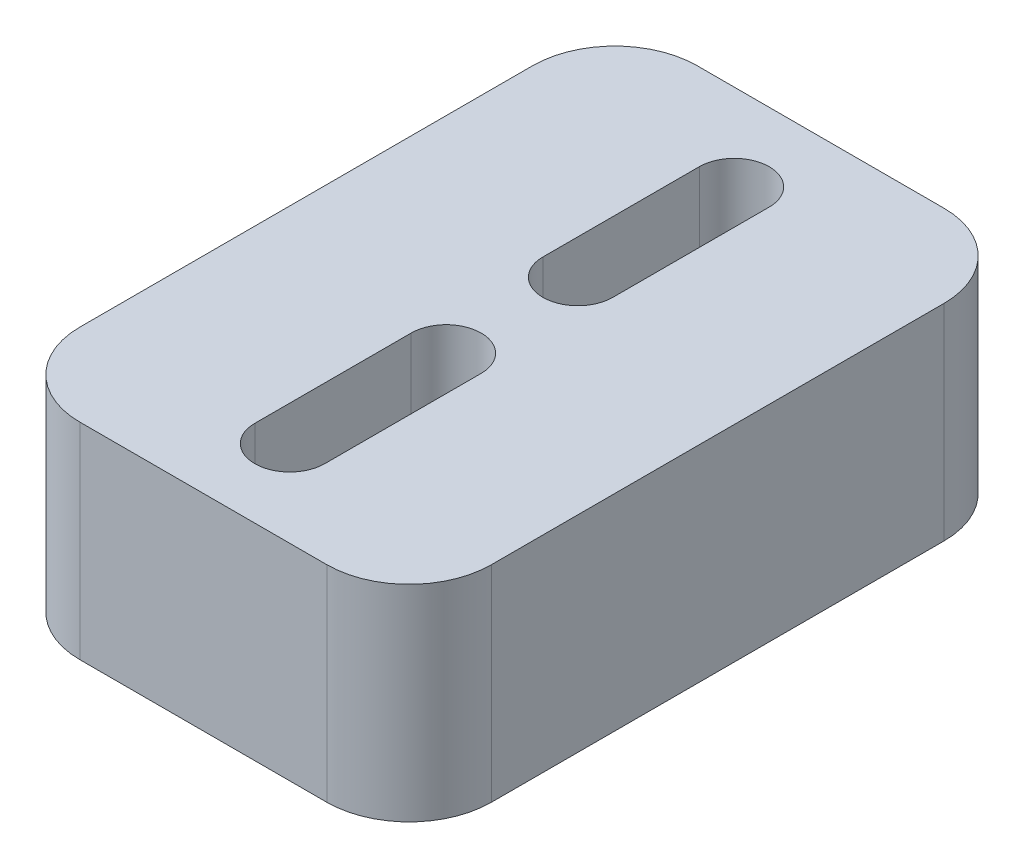
ISO-10303-21;
HEADER;
FILE_DESCRIPTION(('STEP AP214'),'2;1');
FILE_NAME('part.step','',(''),(''),'','','');
FILE_SCHEMA(('AUTOMOTIVE_DESIGN { 1 0 10303 214 1 1 1 1 }'));
ENDSEC;
DATA;
#1=APPLICATION_CONTEXT('core data for automotive mechanical design processes');
#2=APPLICATION_PROTOCOL_DEFINITION('international standard','automotive_design',2000,#1);
#3=PRODUCT_CONTEXT('',#1,'mechanical');
#4=PRODUCT('Part','Part','',(#3));
#5=PRODUCT_RELATED_PRODUCT_CATEGORY('part','',(#4));
#6=PRODUCT_DEFINITION_FORMATION('','',#4);
#7=PRODUCT_DEFINITION_CONTEXT('part definition',#1,'design');
#8=PRODUCT_DEFINITION('design','',#6,#7);
#9=PRODUCT_DEFINITION_SHAPE('','',#8);
#10=(LENGTH_UNIT() NAMED_UNIT(*) SI_UNIT(.MILLI.,.METRE.));
#11=(NAMED_UNIT(*) PLANE_ANGLE_UNIT() SI_UNIT($,.RADIAN.));
#12=(NAMED_UNIT(*) SI_UNIT($,.STERADIAN.) SOLID_ANGLE_UNIT());
#13=UNCERTAINTY_MEASURE_WITH_UNIT(LENGTH_MEASURE(1.E-05),#10,'distance_accuracy_value','');
#14=(GEOMETRIC_REPRESENTATION_CONTEXT(3) GLOBAL_UNCERTAINTY_ASSIGNED_CONTEXT((#13)) GLOBAL_UNIT_ASSIGNED_CONTEXT((#10,
#11,#12)) REPRESENTATION_CONTEXT('',''));
#15=CARTESIAN_POINT('',(0.,0.,0.));
#16=DIRECTION('',(0.,0.,1.));
#17=DIRECTION('',(1.,0.,0.));
#18=AXIS2_PLACEMENT_3D('',#15,#16,#17);
#19=CARTESIAN_POINT('',(0.,10.,0.));
#20=DIRECTION('',(0.,-1.,0.));
#21=DIRECTION('',(0.,0.,-1.));
#22=AXIS2_PLACEMENT_3D('',#19,#20,#21);
#23=PLANE('',#22);
#24=CARTESIAN_POINT('',(0.,10.,-10.8));
#25=DIRECTION('',(0.,1.,0.));
#26=DIRECTION('',(0.,0.,1.));
#27=AXIS2_PLACEMENT_3D('',#24,#25,#26);
#28=CIRCLE('',#27,1.7);
#29=CARTESIAN_POINT('',(1.7,10.,-10.8));
#30=VERTEX_POINT('',#29);
#31=CARTESIAN_POINT('',(-1.7,10.,-10.8));
#32=VERTEX_POINT('',#31);
#33=EDGE_CURVE('E210',#30,#32,#28,.T.);
#34=ORIENTED_EDGE('',*,*,#33,.F.);
#35=DIRECTION('',(0.,0.,-1.));
#36=VECTOR('',#35,1.);
#37=CARTESIAN_POINT('',(1.7,10.,-10.8));
#38=LINE('',#37,#36);
#39=CARTESIAN_POINT('',(1.7,10.,-3.2));
#40=VERTEX_POINT('',#39);
#41=EDGE_CURVE('E221',#40,#30,#38,.T.);
#42=ORIENTED_EDGE('',*,*,#41,.F.);
#43=CARTESIAN_POINT('',(0.,10.,-3.2));
#44=DIRECTION('',(0.,1.,0.));
#45=DIRECTION('',(0.,0.,1.));
#46=AXIS2_PLACEMENT_3D('',#43,#44,#45);
#47=CIRCLE('',#46,1.7);
#48=CARTESIAN_POINT('',(-1.7,10.,-3.2));
#49=VERTEX_POINT('',#48);
#50=EDGE_CURVE('E217',#49,#40,#47,.T.);
#51=ORIENTED_EDGE('',*,*,#50,.F.);
#52=DIRECTION('',(0.,0.,1.));
#53=VECTOR('',#52,1.);
#54=CARTESIAN_POINT('',(-1.7,10.,-10.8));
#55=LINE('',#54,#53);
#56=EDGE_CURVE('E213',#32,#49,#55,.T.);
#57=ORIENTED_EDGE('',*,*,#56,.F.);
#58=EDGE_LOOP('',(#34,#42,#51,#57));
#59=FACE_BOUND('',#58,.T.);
#60=DIRECTION('',(0.,0.,1.));
#61=VECTOR('',#60,1.);
#62=CARTESIAN_POINT('',(-10.,10.,15.));
#63=LINE('',#62,#61);
#64=CARTESIAN_POINT('',(-10.,10.,-11.));
#65=VERTEX_POINT('',#64);
#66=CARTESIAN_POINT('',(-10.,10.,11.));
#67=VERTEX_POINT('',#66);
#68=EDGE_CURVE('E260',#65,#67,#63,.T.);
#69=ORIENTED_EDGE('',*,*,#68,.T.);
#70=CARTESIAN_POINT('',(-6.,10.,11.));
#71=DIRECTION('',(0.,-1.,0.));
#72=DIRECTION('',(0.,0.,-1.));
#73=AXIS2_PLACEMENT_3D('',#70,#71,#72);
#74=CIRCLE('',#73,4.);
#75=CARTESIAN_POINT('',(-6.,10.,15.));
#76=VERTEX_POINT('',#75);
#77=EDGE_CURVE('E315',#67,#76,#74,.F.);
#78=ORIENTED_EDGE('',*,*,#77,.T.);
#79=DIRECTION('',(1.,0.,0.));
#80=VECTOR('',#79,1.);
#81=CARTESIAN_POINT('',(-10.,10.,15.));
#82=LINE('',#81,#80);
#83=CARTESIAN_POINT('',(6.,10.,15.));
#84=VERTEX_POINT('',#83);
#85=EDGE_CURVE('E264',#76,#84,#82,.T.);
#86=ORIENTED_EDGE('',*,*,#85,.T.);
#87=CARTESIAN_POINT('',(6.,10.,11.));
#88=DIRECTION('',(0.,-1.,0.));
#89=DIRECTION('',(0.,0.,-1.));
#90=AXIS2_PLACEMENT_3D('',#87,#88,#89);
#91=CIRCLE('',#90,4.);
#92=CARTESIAN_POINT('',(10.,10.,11.));
#93=VERTEX_POINT('',#92);
#94=EDGE_CURVE('E307',#84,#93,#91,.F.);
#95=ORIENTED_EDGE('',*,*,#94,.T.);
#96=DIRECTION('',(0.,0.,-1.));
#97=VECTOR('',#96,1.);
#98=CARTESIAN_POINT('',(10.,10.,15.));
#99=LINE('',#98,#97);
#100=CARTESIAN_POINT('',(10.,10.,-11.));
#101=VERTEX_POINT('',#100);
#102=EDGE_CURVE('E253',#93,#101,#99,.T.);
#103=ORIENTED_EDGE('',*,*,#102,.T.);
#104=CARTESIAN_POINT('',(6.,10.,-11.));
#105=DIRECTION('',(0.,-1.,0.));
#106=DIRECTION('',(0.,0.,-1.));
#107=AXIS2_PLACEMENT_3D('',#104,#105,#106);
#108=CIRCLE('',#107,4.);
#109=CARTESIAN_POINT('',(6.,10.,-15.));
#110=VERTEX_POINT('',#109);
#111=EDGE_CURVE('E64',#101,#110,#108,.F.);
#112=ORIENTED_EDGE('',*,*,#111,.T.);
#113=DIRECTION('',(-1.,0.,0.));
#114=VECTOR('',#113,1.);
#115=CARTESIAN_POINT('',(-10.,10.,-15.));
#116=LINE('',#115,#114);
#117=CARTESIAN_POINT('',(-6.,10.,-15.));
#118=VERTEX_POINT('',#117);
#119=EDGE_CURVE('E256',#110,#118,#116,.T.);
#120=ORIENTED_EDGE('',*,*,#119,.T.);
#121=CARTESIAN_POINT('',(-6.,10.,-11.));
#122=DIRECTION('',(0.,-1.,0.));
#123=DIRECTION('',(0.,0.,-1.));
#124=AXIS2_PLACEMENT_3D('',#121,#122,#123);
#125=CIRCLE('',#124,4.);
#126=EDGE_CURVE('E312',#118,#65,#125,.F.);
#127=ORIENTED_EDGE('',*,*,#126,.T.);
#128=EDGE_LOOP('',(#69,#78,#86,#95,#103,#112,#120,#127));
#129=FACE_BOUND('',#128,.T.);
#130=CARTESIAN_POINT('',(0.,10.,10.8));
#131=DIRECTION('',(0.,1.,0.));
#132=DIRECTION('',(0.,0.,-1.));
#133=AXIS2_PLACEMENT_3D('',#130,#131,#132);
#134=CIRCLE('',#133,1.7);
#135=CARTESIAN_POINT('',(-1.7,10.,10.8));
#136=VERTEX_POINT('',#135);
#137=CARTESIAN_POINT('',(1.7,10.,10.8));
#138=VERTEX_POINT('',#137);
#139=EDGE_CURVE('E157',#136,#138,#134,.T.);
#140=ORIENTED_EDGE('',*,*,#139,.F.);
#141=DIRECTION('',(0.,0.,1.));
#142=VECTOR('',#141,1.);
#143=CARTESIAN_POINT('',(-1.7,10.,10.8));
#144=LINE('',#143,#142);
#145=CARTESIAN_POINT('',(-1.7,10.,3.2));
#146=VERTEX_POINT('',#145);
#147=EDGE_CURVE('E186',#146,#136,#144,.T.);
#148=ORIENTED_EDGE('',*,*,#147,.F.);
#149=CARTESIAN_POINT('',(0.,10.,3.2));
#150=DIRECTION('',(0.,1.,0.));
#151=DIRECTION('',(0.,0.,-1.));
#152=AXIS2_PLACEMENT_3D('',#149,#150,#151);
#153=CIRCLE('',#152,1.7);
#154=CARTESIAN_POINT('',(1.7,10.,3.2));
#155=VERTEX_POINT('',#154);
#156=EDGE_CURVE('E182',#155,#146,#153,.T.);
#157=ORIENTED_EDGE('',*,*,#156,.F.);
#158=DIRECTION('',(0.,0.,-1.));
#159=VECTOR('',#158,1.);
#160=CARTESIAN_POINT('',(1.7,10.,10.8));
#161=LINE('',#160,#159);
#162=EDGE_CURVE('E168',#138,#155,#161,.T.);
#163=ORIENTED_EDGE('',*,*,#162,.F.);
#164=EDGE_LOOP('',(#140,#148,#157,#163));
#165=FACE_BOUND('',#164,.T.);
#166=ADVANCED_FACE('F41',(#59,#129,#165),#23,.F.);
#167=CARTESIAN_POINT('',(0.,0.,0.));
#168=DIRECTION('',(0.,-1.,0.));
#169=DIRECTION('',(0.,0.,-1.));
#170=AXIS2_PLACEMENT_3D('',#167,#168,#169);
#171=PLANE('',#170);
#172=DIRECTION('',(1.,0.,0.));
#173=VECTOR('',#172,1.);
#174=CARTESIAN_POINT('',(-10.,0.,15.));
#175=LINE('',#174,#173);
#176=CARTESIAN_POINT('',(-6.,0.,15.));
#177=VERTEX_POINT('',#176);
#178=CARTESIAN_POINT('',(6.,0.,15.));
#179=VERTEX_POINT('',#178);
#180=EDGE_CURVE('E257',#177,#179,#175,.T.);
#181=ORIENTED_EDGE('',*,*,#180,.F.);
#182=CARTESIAN_POINT('',(-6.,0.,11.));
#183=DIRECTION('',(0.,-1.,0.));
#184=DIRECTION('',(0.,0.,-1.));
#185=AXIS2_PLACEMENT_3D('',#182,#183,#184);
#186=CIRCLE('',#185,4.);
#187=CARTESIAN_POINT('',(-10.,0.,11.));
#188=VERTEX_POINT('',#187);
#189=EDGE_CURVE('E297',#177,#188,#186,.T.);
#190=ORIENTED_EDGE('',*,*,#189,.T.);
#191=DIRECTION('',(0.,0.,1.));
#192=VECTOR('',#191,1.);
#193=CARTESIAN_POINT('',(-10.,0.,15.));
#194=LINE('',#193,#192);
#195=CARTESIAN_POINT('',(-10.,0.,-11.));
#196=VERTEX_POINT('',#195);
#197=EDGE_CURVE('E275',#196,#188,#194,.T.);
#198=ORIENTED_EDGE('',*,*,#197,.F.);
#199=CARTESIAN_POINT('',(-6.,0.,-11.));
#200=DIRECTION('',(0.,-1.,0.));
#201=DIRECTION('',(0.,0.,-1.));
#202=AXIS2_PLACEMENT_3D('',#199,#200,#201);
#203=CIRCLE('',#202,4.);
#204=CARTESIAN_POINT('',(-6.,0.,-15.));
#205=VERTEX_POINT('',#204);
#206=EDGE_CURVE('E294',#196,#205,#203,.T.);
#207=ORIENTED_EDGE('',*,*,#206,.T.);
#208=DIRECTION('',(-1.,0.,0.));
#209=VECTOR('',#208,1.);
#210=CARTESIAN_POINT('',(-10.,0.,-15.));
#211=LINE('',#210,#209);
#212=CARTESIAN_POINT('',(6.,0.,-15.));
#213=VERTEX_POINT('',#212);
#214=EDGE_CURVE('E272',#213,#205,#211,.T.);
#215=ORIENTED_EDGE('',*,*,#214,.F.);
#216=CARTESIAN_POINT('',(6.,0.,-11.));
#217=DIRECTION('',(0.,-1.,0.));
#218=DIRECTION('',(0.,0.,-1.));
#219=AXIS2_PLACEMENT_3D('',#216,#217,#218);
#220=CIRCLE('',#219,4.);
#221=CARTESIAN_POINT('',(10.,0.,-11.));
#222=VERTEX_POINT('',#221);
#223=EDGE_CURVE('E291',#213,#222,#220,.T.);
#224=ORIENTED_EDGE('',*,*,#223,.T.);
#225=DIRECTION('',(0.,0.,-1.));
#226=VECTOR('',#225,1.);
#227=CARTESIAN_POINT('',(10.,0.,15.));
#228=LINE('',#227,#226);
#229=CARTESIAN_POINT('',(10.,0.,11.));
#230=VERTEX_POINT('',#229);
#231=EDGE_CURVE('E252',#230,#222,#228,.T.);
#232=ORIENTED_EDGE('',*,*,#231,.F.);
#233=CARTESIAN_POINT('',(6.,0.,11.));
#234=DIRECTION('',(0.,-1.,0.));
#235=DIRECTION('',(0.,0.,-1.));
#236=AXIS2_PLACEMENT_3D('',#233,#234,#235);
#237=CIRCLE('',#236,4.);
#238=EDGE_CURVE('E288',#230,#179,#237,.T.);
#239=ORIENTED_EDGE('',*,*,#238,.T.);
#240=EDGE_LOOP('',(#181,#190,#198,#207,#215,#224,#232,#239));
#241=FACE_BOUND('',#240,.T.);
#242=DIRECTION('',(0.,0.,-1.));
#243=VECTOR('',#242,1.);
#244=CARTESIAN_POINT('',(1.7,0.,-10.8));
#245=LINE('',#244,#243);
#246=CARTESIAN_POINT('',(1.7,0.,-3.2));
#247=VERTEX_POINT('',#246);
#248=CARTESIAN_POINT('',(1.7,0.,-10.8));
#249=VERTEX_POINT('',#248);
#250=EDGE_CURVE('E214',#247,#249,#245,.T.);
#251=ORIENTED_EDGE('',*,*,#250,.T.);
#252=CARTESIAN_POINT('',(0.,0.,-10.8));
#253=DIRECTION('',(0.,1.,0.));
#254=DIRECTION('',(0.,0.,1.));
#255=AXIS2_PLACEMENT_3D('',#252,#253,#254);
#256=CIRCLE('',#255,1.7);
#257=CARTESIAN_POINT('',(-1.7,0.,-10.8));
#258=VERTEX_POINT('',#257);
#259=EDGE_CURVE('E177',#249,#258,#256,.T.);
#260=ORIENTED_EDGE('',*,*,#259,.T.);
#261=DIRECTION('',(0.,0.,1.));
#262=VECTOR('',#261,1.);
#263=CARTESIAN_POINT('',(-1.7,0.,-10.8));
#264=LINE('',#263,#262);
#265=CARTESIAN_POINT('',(-1.7,0.,-3.2));
#266=VERTEX_POINT('',#265);
#267=EDGE_CURVE('E228',#258,#266,#264,.T.);
#268=ORIENTED_EDGE('',*,*,#267,.T.);
#269=CARTESIAN_POINT('',(0.,0.,-3.2));
#270=DIRECTION('',(0.,1.,0.));
#271=DIRECTION('',(0.,0.,1.));
#272=AXIS2_PLACEMENT_3D('',#269,#270,#271);
#273=CIRCLE('',#272,1.7);
#274=EDGE_CURVE('E232',#266,#247,#273,.T.);
#275=ORIENTED_EDGE('',*,*,#274,.T.);
#276=EDGE_LOOP('',(#251,#260,#268,#275));
#277=FACE_BOUND('',#276,.T.);
#278=DIRECTION('',(0.,0.,1.));
#279=VECTOR('',#278,1.);
#280=CARTESIAN_POINT('',(-1.7,0.,10.8));
#281=LINE('',#280,#279);
#282=CARTESIAN_POINT('',(-1.7,0.,3.2));
#283=VERTEX_POINT('',#282);
#284=CARTESIAN_POINT('',(-1.7,0.,10.8));
#285=VERTEX_POINT('',#284);
#286=EDGE_CURVE('E169',#283,#285,#281,.T.);
#287=ORIENTED_EDGE('',*,*,#286,.T.);
#288=CARTESIAN_POINT('',(0.,0.,10.8));
#289=DIRECTION('',(0.,1.,0.));
#290=DIRECTION('',(0.,0.,-1.));
#291=AXIS2_PLACEMENT_3D('',#288,#289,#290);
#292=CIRCLE('',#291,1.7);
#293=CARTESIAN_POINT('',(1.7,0.,10.8));
#294=VERTEX_POINT('',#293);
#295=EDGE_CURVE('E191',#285,#294,#292,.T.);
#296=ORIENTED_EDGE('',*,*,#295,.T.);
#297=DIRECTION('',(0.,0.,-1.));
#298=VECTOR('',#297,1.);
#299=CARTESIAN_POINT('',(1.7,0.,10.8));
#300=LINE('',#299,#298);
#301=CARTESIAN_POINT('',(1.7,0.,3.2));
#302=VERTEX_POINT('',#301);
#303=EDGE_CURVE('E175',#294,#302,#300,.T.);
#304=ORIENTED_EDGE('',*,*,#303,.T.);
#305=CARTESIAN_POINT('',(0.,0.,3.2));
#306=DIRECTION('',(0.,1.,0.));
#307=DIRECTION('',(0.,0.,-1.));
#308=AXIS2_PLACEMENT_3D('',#305,#306,#307);
#309=CIRCLE('',#308,1.7);
#310=EDGE_CURVE('E196',#302,#283,#309,.T.);
#311=ORIENTED_EDGE('',*,*,#310,.T.);
#312=EDGE_LOOP('',(#287,#296,#304,#311));
#313=FACE_BOUND('',#312,.T.);
#314=ADVANCED_FACE('F335',(#241,#277,#313),#171,.T.);
#315=CARTESIAN_POINT('',(10.,10.,15.));
#316=DIRECTION('',(-1.,0.,0.));
#317=DIRECTION('',(0.,0.,1.));
#318=AXIS2_PLACEMENT_3D('',#315,#316,#317);
#319=PLANE('',#318);
#320=ORIENTED_EDGE('',*,*,#231,.T.);
#321=DIRECTION('',(0.,-1.,0.));
#322=VECTOR('',#321,1.);
#323=CARTESIAN_POINT('',(10.,10.,-11.));
#324=LINE('',#323,#322);
#325=EDGE_CURVE('E11',#222,#101,#324,.F.);
#326=ORIENTED_EDGE('',*,*,#325,.T.);
#327=ORIENTED_EDGE('',*,*,#102,.F.);
#328=DIRECTION('',(0.,-1.,0.));
#329=VECTOR('',#328,1.);
#330=CARTESIAN_POINT('',(10.,10.,11.));
#331=LINE('',#330,#329);
#332=EDGE_CURVE('E50',#93,#230,#331,.T.);
#333=ORIENTED_EDGE('',*,*,#332,.T.);
#334=EDGE_LOOP('',(#320,#326,#327,#333));
#335=FACE_BOUND('',#334,.T.);
#336=ADVANCED_FACE('F329',(#335),#319,.F.);
#337=CARTESIAN_POINT('',(-10.,10.,-15.));
#338=DIRECTION('',(0.,0.,1.));
#339=DIRECTION('',(1.,0.,0.));
#340=AXIS2_PLACEMENT_3D('',#337,#338,#339);
#341=PLANE('',#340);
#342=ORIENTED_EDGE('',*,*,#214,.T.);
#343=DIRECTION('',(0.,-1.,0.));
#344=VECTOR('',#343,1.);
#345=CARTESIAN_POINT('',(-6.,10.,-15.));
#346=LINE('',#345,#344);
#347=EDGE_CURVE('E57',#205,#118,#346,.F.);
#348=ORIENTED_EDGE('',*,*,#347,.T.);
#349=ORIENTED_EDGE('',*,*,#119,.F.);
#350=DIRECTION('',(0.,-1.,0.));
#351=VECTOR('',#350,1.);
#352=CARTESIAN_POINT('',(6.,10.,-15.));
#353=LINE('',#352,#351);
#354=EDGE_CURVE('E318',#110,#213,#353,.T.);
#355=ORIENTED_EDGE('',*,*,#354,.T.);
#356=EDGE_LOOP('',(#342,#348,#349,#355));
#357=FACE_BOUND('',#356,.T.);
#358=ADVANCED_FACE('F341',(#357),#341,.F.);
#359=CARTESIAN_POINT('',(-10.,10.,15.));
#360=DIRECTION('',(1.,0.,0.));
#361=DIRECTION('',(0.,0.,-1.));
#362=AXIS2_PLACEMENT_3D('',#359,#360,#361);
#363=PLANE('',#362);
#364=ORIENTED_EDGE('',*,*,#197,.T.);
#365=DIRECTION('',(0.,-1.,0.));
#366=VECTOR('',#365,1.);
#367=CARTESIAN_POINT('',(-10.,10.,11.));
#368=LINE('',#367,#366);
#369=EDGE_CURVE('E304',#188,#67,#368,.F.);
#370=ORIENTED_EDGE('',*,*,#369,.T.);
#371=ORIENTED_EDGE('',*,*,#68,.F.);
#372=DIRECTION('',(0.,-1.,0.));
#373=VECTOR('',#372,1.);
#374=CARTESIAN_POINT('',(-10.,10.,-11.));
#375=LINE('',#374,#373);
#376=EDGE_CURVE('E300',#65,#196,#375,.T.);
#377=ORIENTED_EDGE('',*,*,#376,.T.);
#378=EDGE_LOOP('',(#364,#370,#371,#377));
#379=FACE_BOUND('',#378,.T.);
#380=ADVANCED_FACE('F349',(#379),#363,.F.);
#381=CARTESIAN_POINT('',(-10.,10.,15.));
#382=DIRECTION('',(0.,0.,-1.));
#383=DIRECTION('',(-1.,0.,0.));
#384=AXIS2_PLACEMENT_3D('',#381,#382,#383);
#385=PLANE('',#384);
#386=ORIENTED_EDGE('',*,*,#85,.F.);
#387=DIRECTION('',(0.,-1.,0.));
#388=VECTOR('',#387,1.);
#389=CARTESIAN_POINT('',(-6.,10.,15.));
#390=LINE('',#389,#388);
#391=EDGE_CURVE('E284',#76,#177,#390,.T.);
#392=ORIENTED_EDGE('',*,*,#391,.T.);
#393=ORIENTED_EDGE('',*,*,#180,.T.);
#394=DIRECTION('',(0.,-1.,0.));
#395=VECTOR('',#394,1.);
#396=CARTESIAN_POINT('',(6.,10.,15.));
#397=LINE('',#396,#395);
#398=EDGE_CURVE('E268',#179,#84,#397,.F.);
#399=ORIENTED_EDGE('',*,*,#398,.T.);
#400=EDGE_LOOP('',(#386,#392,#393,#399));
#401=FACE_BOUND('',#400,.T.);
#402=ADVANCED_FACE('F357',(#401),#385,.F.);
#403=CARTESIAN_POINT('',(0.,10.,-10.8));
#404=DIRECTION('',(0.,-1.,0.));
#405=DIRECTION('',(0.,0.,-1.));
#406=AXIS2_PLACEMENT_3D('',#403,#404,#405);
#407=CYLINDRICAL_SURFACE('',#406,1.7);
#408=ORIENTED_EDGE('',*,*,#259,.F.);
#409=DIRECTION('',(0.,-1.,0.));
#410=VECTOR('',#409,1.);
#411=CARTESIAN_POINT('',(1.7,10.,-10.8));
#412=LINE('',#411,#410);
#413=EDGE_CURVE('E224',#30,#249,#412,.T.);
#414=ORIENTED_EDGE('',*,*,#413,.F.);
#415=ORIENTED_EDGE('',*,*,#33,.T.);
#416=DIRECTION('',(0.,-1.,0.));
#417=VECTOR('',#416,1.);
#418=CARTESIAN_POINT('',(-1.7,10.,-10.8));
#419=LINE('',#418,#417);
#420=EDGE_CURVE('E248',#32,#258,#419,.T.);
#421=ORIENTED_EDGE('',*,*,#420,.T.);
#422=EDGE_LOOP('',(#408,#414,#415,#421));
#423=FACE_BOUND('',#422,.T.);
#424=ADVANCED_FACE('F372',(#423),#407,.F.);
#425=CARTESIAN_POINT('',(-1.7,10.,-10.8));
#426=DIRECTION('',(1.,0.,0.));
#427=DIRECTION('',(0.,0.,-1.));
#428=AXIS2_PLACEMENT_3D('',#425,#426,#427);
#429=PLANE('',#428);
#430=ORIENTED_EDGE('',*,*,#267,.F.);
#431=ORIENTED_EDGE('',*,*,#420,.F.);
#432=ORIENTED_EDGE('',*,*,#56,.T.);
#433=DIRECTION('',(0.,-1.,0.));
#434=VECTOR('',#433,1.);
#435=CARTESIAN_POINT('',(-1.7,10.,-3.2));
#436=LINE('',#435,#434);
#437=EDGE_CURVE('E245',#49,#266,#436,.T.);
#438=ORIENTED_EDGE('',*,*,#437,.T.);
#439=EDGE_LOOP('',(#430,#431,#432,#438));
#440=FACE_BOUND('',#439,.T.);
#441=ADVANCED_FACE('F457',(#440),#429,.T.);
#442=CARTESIAN_POINT('',(0.,10.,-3.2));
#443=DIRECTION('',(0.,-1.,0.));
#444=DIRECTION('',(0.,0.,-1.));
#445=AXIS2_PLACEMENT_3D('',#442,#443,#444);
#446=CYLINDRICAL_SURFACE('',#445,1.7);
#447=ORIENTED_EDGE('',*,*,#274,.F.);
#448=ORIENTED_EDGE('',*,*,#437,.F.);
#449=ORIENTED_EDGE('',*,*,#50,.T.);
#450=DIRECTION('',(0.,-1.,0.));
#451=VECTOR('',#450,1.);
#452=CARTESIAN_POINT('',(1.7,10.,-3.2));
#453=LINE('',#452,#451);
#454=EDGE_CURVE('E242',#40,#247,#453,.T.);
#455=ORIENTED_EDGE('',*,*,#454,.T.);
#456=EDGE_LOOP('',(#447,#448,#449,#455));
#457=FACE_BOUND('',#456,.T.);
#458=ADVANCED_FACE('F448',(#457),#446,.F.);
#459=CARTESIAN_POINT('',(1.7,10.,-10.8));
#460=DIRECTION('',(-1.,0.,0.));
#461=DIRECTION('',(0.,0.,1.));
#462=AXIS2_PLACEMENT_3D('',#459,#460,#461);
#463=PLANE('',#462);
#464=ORIENTED_EDGE('',*,*,#250,.F.);
#465=ORIENTED_EDGE('',*,*,#454,.F.);
#466=ORIENTED_EDGE('',*,*,#41,.T.);
#467=ORIENTED_EDGE('',*,*,#413,.T.);
#468=EDGE_LOOP('',(#464,#465,#466,#467));
#469=FACE_BOUND('',#468,.T.);
#470=ADVANCED_FACE('F440',(#469),#463,.T.);
#471=CARTESIAN_POINT('',(0.,10.,10.8));
#472=DIRECTION('',(0.,-1.,0.));
#473=DIRECTION('',(0.,0.,-1.));
#474=AXIS2_PLACEMENT_3D('',#471,#472,#473);
#475=CYLINDRICAL_SURFACE('',#474,1.7);
#476=ORIENTED_EDGE('',*,*,#295,.F.);
#477=DIRECTION('',(0.,-1.,0.));
#478=VECTOR('',#477,1.);
#479=CARTESIAN_POINT('',(-1.7,10.,10.8));
#480=LINE('',#479,#478);
#481=EDGE_CURVE('E163',#136,#285,#480,.T.);
#482=ORIENTED_EDGE('',*,*,#481,.F.);
#483=ORIENTED_EDGE('',*,*,#139,.T.);
#484=DIRECTION('',(0.,-1.,0.));
#485=VECTOR('',#484,1.);
#486=CARTESIAN_POINT('',(1.7,10.,10.8));
#487=LINE('',#486,#485);
#488=EDGE_CURVE('E160',#138,#294,#487,.T.);
#489=ORIENTED_EDGE('',*,*,#488,.T.);
#490=EDGE_LOOP('',(#476,#482,#483,#489));
#491=FACE_BOUND('',#490,.T.);
#492=ADVANCED_FACE('F159',(#491),#475,.F.);
#493=CARTESIAN_POINT('',(1.7,10.,10.8));
#494=DIRECTION('',(-1.,0.,0.));
#495=DIRECTION('',(0.,0.,1.));
#496=AXIS2_PLACEMENT_3D('',#493,#494,#495);
#497=PLANE('',#496);
#498=ORIENTED_EDGE('',*,*,#303,.F.);
#499=ORIENTED_EDGE('',*,*,#488,.F.);
#500=ORIENTED_EDGE('',*,*,#162,.T.);
#501=DIRECTION('',(0.,-1.,0.));
#502=VECTOR('',#501,1.);
#503=CARTESIAN_POINT('',(1.7,10.,3.2));
#504=LINE('',#503,#502);
#505=EDGE_CURVE('E178',#155,#302,#504,.T.);
#506=ORIENTED_EDGE('',*,*,#505,.T.);
#507=EDGE_LOOP('',(#498,#499,#500,#506));
#508=FACE_BOUND('',#507,.T.);
#509=ADVANCED_FACE('F172',(#508),#497,.T.);
#510=CARTESIAN_POINT('',(0.,10.,3.2));
#511=DIRECTION('',(0.,-1.,0.));
#512=DIRECTION('',(0.,0.,-1.));
#513=AXIS2_PLACEMENT_3D('',#510,#511,#512);
#514=CYLINDRICAL_SURFACE('',#513,1.7);
#515=ORIENTED_EDGE('',*,*,#310,.F.);
#516=ORIENTED_EDGE('',*,*,#505,.F.);
#517=ORIENTED_EDGE('',*,*,#156,.T.);
#518=DIRECTION('',(0.,-1.,0.));
#519=VECTOR('',#518,1.);
#520=CARTESIAN_POINT('',(-1.7,10.,3.2));
#521=LINE('',#520,#519);
#522=EDGE_CURVE('E205',#146,#283,#521,.T.);
#523=ORIENTED_EDGE('',*,*,#522,.T.);
#524=EDGE_LOOP('',(#515,#516,#517,#523));
#525=FACE_BOUND('',#524,.T.);
#526=ADVANCED_FACE('F416',(#525),#514,.F.);
#527=CARTESIAN_POINT('',(-1.7,10.,10.8));
#528=DIRECTION('',(1.,0.,0.));
#529=DIRECTION('',(0.,0.,-1.));
#530=AXIS2_PLACEMENT_3D('',#527,#528,#529);
#531=PLANE('',#530);
#532=ORIENTED_EDGE('',*,*,#286,.F.);
#533=ORIENTED_EDGE('',*,*,#522,.F.);
#534=ORIENTED_EDGE('',*,*,#147,.T.);
#535=ORIENTED_EDGE('',*,*,#481,.T.);
#536=EDGE_LOOP('',(#532,#533,#534,#535));
#537=FACE_BOUND('',#536,.T.);
#538=ADVANCED_FACE('F385',(#537),#531,.T.);
#539=CARTESIAN_POINT('',(-6.,10.,11.));
#540=DIRECTION('',(0.,-1.,0.));
#541=DIRECTION('',(0.,0.,-1.));
#542=AXIS2_PLACEMENT_3D('',#539,#540,#541);
#543=CYLINDRICAL_SURFACE('',#542,4.);
#544=ORIENTED_EDGE('',*,*,#77,.F.);
#545=ORIENTED_EDGE('',*,*,#369,.F.);
#546=ORIENTED_EDGE('',*,*,#189,.F.);
#547=ORIENTED_EDGE('',*,*,#391,.F.);
#548=EDGE_LOOP('',(#544,#545,#546,#547));
#549=FACE_BOUND('',#548,.T.);
#550=ADVANCED_FACE('F354',(#549),#543,.T.);
#551=CARTESIAN_POINT('',(-6.,10.,-11.));
#552=DIRECTION('',(0.,-1.,0.));
#553=DIRECTION('',(0.,0.,-1.));
#554=AXIS2_PLACEMENT_3D('',#551,#552,#553);
#555=CYLINDRICAL_SURFACE('',#554,4.);
#556=ORIENTED_EDGE('',*,*,#126,.F.);
#557=ORIENTED_EDGE('',*,*,#347,.F.);
#558=ORIENTED_EDGE('',*,*,#206,.F.);
#559=ORIENTED_EDGE('',*,*,#376,.F.);
#560=EDGE_LOOP('',(#556,#557,#558,#559));
#561=FACE_BOUND('',#560,.T.);
#562=ADVANCED_FACE('F346',(#561),#555,.T.);
#563=CARTESIAN_POINT('',(6.,10.,-11.));
#564=DIRECTION('',(0.,-1.,0.));
#565=DIRECTION('',(0.,0.,-1.));
#566=AXIS2_PLACEMENT_3D('',#563,#564,#565);
#567=CYLINDRICAL_SURFACE('',#566,4.);
#568=ORIENTED_EDGE('',*,*,#111,.F.);
#569=ORIENTED_EDGE('',*,*,#325,.F.);
#570=ORIENTED_EDGE('',*,*,#223,.F.);
#571=ORIENTED_EDGE('',*,*,#354,.F.);
#572=EDGE_LOOP('',(#568,#569,#570,#571));
#573=FACE_BOUND('',#572,.T.);
#574=ADVANCED_FACE('F340',(#573),#567,.T.);
#575=CARTESIAN_POINT('',(6.,10.,11.));
#576=DIRECTION('',(0.,-1.,0.));
#577=DIRECTION('',(0.,0.,-1.));
#578=AXIS2_PLACEMENT_3D('',#575,#576,#577);
#579=CYLINDRICAL_SURFACE('',#578,4.);
#580=ORIENTED_EDGE('',*,*,#94,.F.);
#581=ORIENTED_EDGE('',*,*,#398,.F.);
#582=ORIENTED_EDGE('',*,*,#238,.F.);
#583=ORIENTED_EDGE('',*,*,#332,.F.);
#584=EDGE_LOOP('',(#580,#581,#582,#583));
#585=FACE_BOUND('',#584,.T.);
#586=ADVANCED_FACE('F43',(#585),#579,.T.);
#587=CLOSED_SHELL('',(#166,#314,#336,#358,#380,#402,#424,#441,#458,#470,#492,#509,#526,#538,
#550,#562,#574,#586));
#588=MANIFOLD_SOLID_BREP('B2',#587);
#589=ADVANCED_BREP_SHAPE_REPRESENTATION('',(#18,#588),#14);
#590=SHAPE_DEFINITION_REPRESENTATION(#9,#589);
ENDSEC;
END-ISO-10303-21;
